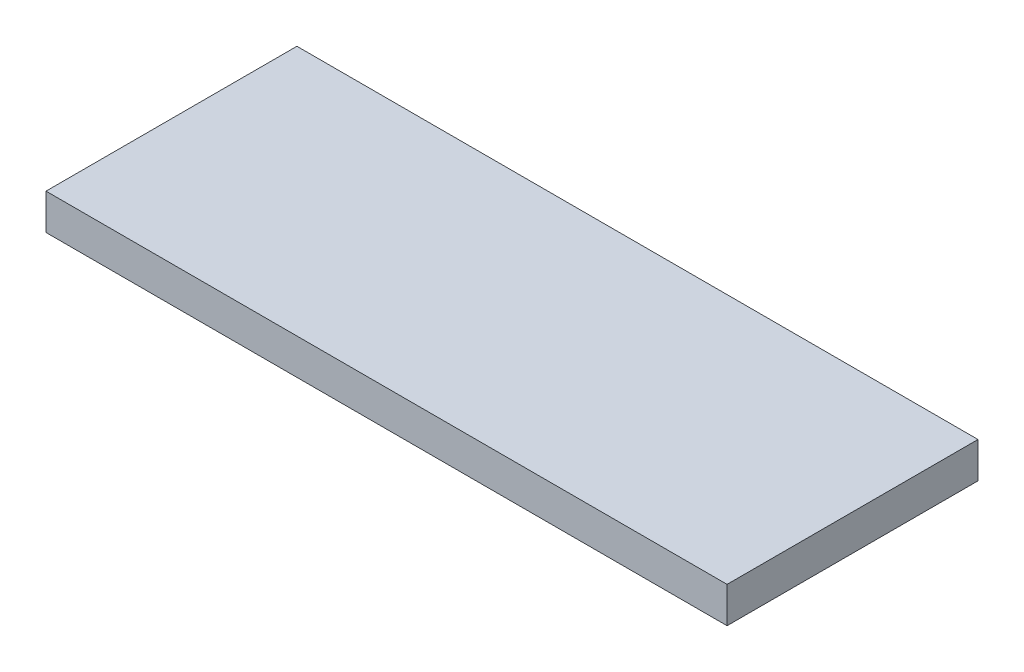
ISO-10303-21;
HEADER;
FILE_DESCRIPTION(('STEP AP214'),'2;1');
FILE_NAME('part.step','',(''),(''),'','','');
FILE_SCHEMA(('AUTOMOTIVE_DESIGN { 1 0 10303 214 1 1 1 1 }'));
ENDSEC;
DATA;
#1=APPLICATION_CONTEXT('core data for automotive mechanical design processes');
#2=APPLICATION_PROTOCOL_DEFINITION('international standard','automotive_design',2000,#1);
#3=PRODUCT_CONTEXT('',#1,'mechanical');
#4=PRODUCT('Part','Part','',(#3));
#5=PRODUCT_RELATED_PRODUCT_CATEGORY('part','',(#4));
#6=PRODUCT_DEFINITION_FORMATION('','',#4);
#7=PRODUCT_DEFINITION_CONTEXT('part definition',#1,'design');
#8=PRODUCT_DEFINITION('design','',#6,#7);
#9=PRODUCT_DEFINITION_SHAPE('','',#8);
#10=(LENGTH_UNIT() NAMED_UNIT(*) SI_UNIT(.MILLI.,.METRE.));
#11=(NAMED_UNIT(*) PLANE_ANGLE_UNIT() SI_UNIT($,.RADIAN.));
#12=(NAMED_UNIT(*) SI_UNIT($,.STERADIAN.) SOLID_ANGLE_UNIT());
#13=UNCERTAINTY_MEASURE_WITH_UNIT(LENGTH_MEASURE(1.E-05),#10,'distance_accuracy_value','');
#14=(GEOMETRIC_REPRESENTATION_CONTEXT(3) GLOBAL_UNCERTAINTY_ASSIGNED_CONTEXT((#13)) GLOBAL_UNIT_ASSIGNED_CONTEXT((#10,
#11,#12)) REPRESENTATION_CONTEXT('',''));
#15=CARTESIAN_POINT('',(0.,0.,0.));
#16=DIRECTION('',(0.,0.,1.));
#17=DIRECTION('',(1.,0.,0.));
#18=AXIS2_PLACEMENT_3D('',#15,#16,#17);
#19=CARTESIAN_POINT('',(950.,0.,0.));
#20=DIRECTION('',(0.,0.,-1.));
#21=DIRECTION('',(-1.,0.,0.));
#22=AXIS2_PLACEMENT_3D('',#19,#20,#21);
#23=PLANE('',#22);
#24=DIRECTION('',(0.,-1.,0.));
#25=VECTOR('',#24,1.);
#26=CARTESIAN_POINT('',(0.,0.,0.));
#27=LINE('',#26,#25);
#28=CARTESIAN_POINT('',(0.,50.,0.));
#29=VERTEX_POINT('',#28);
#30=CARTESIAN_POINT('',(0.,0.,0.));
#31=VERTEX_POINT('',#30);
#32=EDGE_CURVE('E107',#29,#31,#27,.T.);
#33=ORIENTED_EDGE('',*,*,#32,.T.);
#34=DIRECTION('',(-1.,0.,0.));
#35=VECTOR('',#34,1.);
#36=CARTESIAN_POINT('',(950.,0.,0.));
#37=LINE('',#36,#35);
#38=CARTESIAN_POINT('',(950.,0.,0.));
#39=VERTEX_POINT('',#38);
#40=EDGE_CURVE('E11',#39,#31,#37,.T.);
#41=ORIENTED_EDGE('',*,*,#40,.F.);
#42=DIRECTION('',(0.,-1.,0.));
#43=VECTOR('',#42,1.);
#44=CARTESIAN_POINT('',(950.,0.,0.));
#45=LINE('',#44,#43);
#46=CARTESIAN_POINT('',(950.,50.,0.));
#47=VERTEX_POINT('',#46);
#48=EDGE_CURVE('E91',#47,#39,#45,.T.);
#49=ORIENTED_EDGE('',*,*,#48,.F.);
#50=DIRECTION('',(-1.,0.,0.));
#51=VECTOR('',#50,1.);
#52=CARTESIAN_POINT('',(950.,50.,0.));
#53=LINE('',#52,#51);
#54=EDGE_CURVE('E103',#47,#29,#53,.T.);
#55=ORIENTED_EDGE('',*,*,#54,.T.);
#56=EDGE_LOOP('',(#33,#41,#49,#55));
#57=FACE_BOUND('',#56,.T.);
#58=ADVANCED_FACE('F39',(#57),#23,.F.);
#59=CARTESIAN_POINT('',(950.,0.,0.));
#60=DIRECTION('',(0.,1.,0.));
#61=DIRECTION('',(0.,0.,1.));
#62=AXIS2_PLACEMENT_3D('',#59,#60,#61);
#63=PLANE('',#62);
#64=DIRECTION('',(0.,0.,-1.));
#65=VECTOR('',#64,1.);
#66=CARTESIAN_POINT('',(0.,0.,0.));
#67=LINE('',#66,#65);
#68=CARTESIAN_POINT('',(0.,0.,-350.));
#69=VERTEX_POINT('',#68);
#70=EDGE_CURVE('E96',#31,#69,#67,.T.);
#71=ORIENTED_EDGE('',*,*,#70,.T.);
#72=DIRECTION('',(-1.,0.,0.));
#73=VECTOR('',#72,1.);
#74=CARTESIAN_POINT('',(950.,0.,-350.));
#75=LINE('',#74,#73);
#76=CARTESIAN_POINT('',(950.,0.,-350.));
#77=VERTEX_POINT('',#76);
#78=EDGE_CURVE('E48',#77,#69,#75,.T.);
#79=ORIENTED_EDGE('',*,*,#78,.F.);
#80=DIRECTION('',(0.,0.,-1.));
#81=VECTOR('',#80,1.);
#82=CARTESIAN_POINT('',(950.,0.,0.));
#83=LINE('',#82,#81);
#84=EDGE_CURVE('E86',#39,#77,#83,.T.);
#85=ORIENTED_EDGE('',*,*,#84,.F.);
#86=ORIENTED_EDGE('',*,*,#40,.T.);
#87=EDGE_LOOP('',(#71,#79,#85,#86));
#88=FACE_BOUND('',#87,.T.);
#89=ADVANCED_FACE('F95',(#88),#63,.F.);
#90=CARTESIAN_POINT('',(950.,0.,-350.));
#91=DIRECTION('',(0.,0.,1.));
#92=DIRECTION('',(1.,0.,0.));
#93=AXIS2_PLACEMENT_3D('',#90,#91,#92);
#94=PLANE('',#93);
#95=DIRECTION('',(0.,1.,0.));
#96=VECTOR('',#95,1.);
#97=CARTESIAN_POINT('',(0.,0.,-350.));
#98=LINE('',#97,#96);
#99=CARTESIAN_POINT('',(0.,50.,-350.));
#100=VERTEX_POINT('',#99);
#101=EDGE_CURVE('E73',#69,#100,#98,.T.);
#102=ORIENTED_EDGE('',*,*,#101,.T.);
#103=DIRECTION('',(-1.,0.,0.));
#104=VECTOR('',#103,1.);
#105=CARTESIAN_POINT('',(950.,50.,-350.));
#106=LINE('',#105,#104);
#107=CARTESIAN_POINT('',(950.,50.,-350.));
#108=VERTEX_POINT('',#107);
#109=EDGE_CURVE('E98',#108,#100,#106,.T.);
#110=ORIENTED_EDGE('',*,*,#109,.F.);
#111=DIRECTION('',(0.,1.,0.));
#112=VECTOR('',#111,1.);
#113=CARTESIAN_POINT('',(950.,0.,-350.));
#114=LINE('',#113,#112);
#115=EDGE_CURVE('E89',#77,#108,#114,.T.);
#116=ORIENTED_EDGE('',*,*,#115,.F.);
#117=ORIENTED_EDGE('',*,*,#78,.T.);
#118=EDGE_LOOP('',(#102,#110,#116,#117));
#119=FACE_BOUND('',#118,.T.);
#120=ADVANCED_FACE('F99',(#119),#94,.F.);
#121=CARTESIAN_POINT('',(950.,50.,0.));
#122=DIRECTION('',(0.,-1.,0.));
#123=DIRECTION('',(0.,0.,-1.));
#124=AXIS2_PLACEMENT_3D('',#121,#122,#123);
#125=PLANE('',#124);
#126=DIRECTION('',(0.,0.,1.));
#127=VECTOR('',#126,1.);
#128=CARTESIAN_POINT('',(0.,50.,0.));
#129=LINE('',#128,#127);
#130=EDGE_CURVE('E79',#100,#29,#129,.T.);
#131=ORIENTED_EDGE('',*,*,#130,.T.);
#132=ORIENTED_EDGE('',*,*,#54,.F.);
#133=DIRECTION('',(0.,0.,1.));
#134=VECTOR('',#133,1.);
#135=CARTESIAN_POINT('',(950.,50.,0.));
#136=LINE('',#135,#134);
#137=EDGE_CURVE('E56',#108,#47,#136,.T.);
#138=ORIENTED_EDGE('',*,*,#137,.F.);
#139=ORIENTED_EDGE('',*,*,#109,.T.);
#140=EDGE_LOOP('',(#131,#132,#138,#139));
#141=FACE_BOUND('',#140,.T.);
#142=ADVANCED_FACE('F120',(#141),#125,.F.);
#143=CARTESIAN_POINT('',(950.,0.,0.));
#144=DIRECTION('',(-1.,0.,0.));
#145=DIRECTION('',(0.,0.,1.));
#146=AXIS2_PLACEMENT_3D('',#143,#144,#145);
#147=PLANE('',#146);
#148=ORIENTED_EDGE('',*,*,#48,.T.);
#149=ORIENTED_EDGE('',*,*,#84,.T.);
#150=ORIENTED_EDGE('',*,*,#115,.T.);
#151=ORIENTED_EDGE('',*,*,#137,.T.);
#152=EDGE_LOOP('',(#148,#149,#150,#151));
#153=FACE_BOUND('',#152,.T.);
#154=ADVANCED_FACE('F87',(#153),#147,.F.);
#155=CARTESIAN_POINT('',(0.,0.,0.));
#156=DIRECTION('',(-1.,0.,0.));
#157=DIRECTION('',(0.,0.,1.));
#158=AXIS2_PLACEMENT_3D('',#155,#156,#157);
#159=PLANE('',#158);
#160=ORIENTED_EDGE('',*,*,#32,.F.);
#161=ORIENTED_EDGE('',*,*,#130,.F.);
#162=ORIENTED_EDGE('',*,*,#101,.F.);
#163=ORIENTED_EDGE('',*,*,#70,.F.);
#164=EDGE_LOOP('',(#160,#161,#162,#163));
#165=FACE_BOUND('',#164,.T.);
#166=ADVANCED_FACE('F123',(#165),#159,.T.);
#167=CLOSED_SHELL('',(#58,#89,#120,#142,#154,#166));
#168=MANIFOLD_SOLID_BREP('B2',#167);
#169=ADVANCED_BREP_SHAPE_REPRESENTATION('',(#18,#168),#14);
#170=SHAPE_DEFINITION_REPRESENTATION(#9,#169);
ENDSEC;
END-ISO-10303-21;
